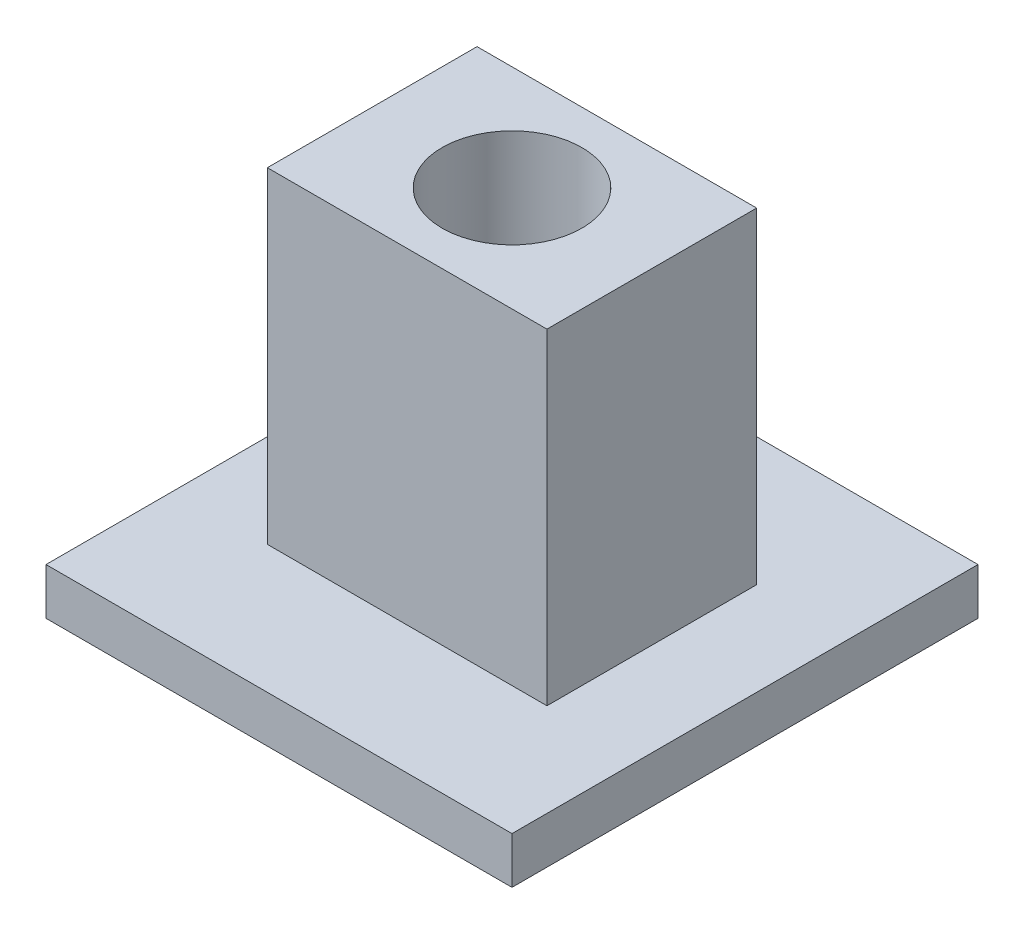
ISO-10303-21;
HEADER;
FILE_DESCRIPTION(('STEP AP214'),'2;1');
FILE_NAME('part.step','',(''),(''),'','','');
FILE_SCHEMA(('AUTOMOTIVE_DESIGN { 1 0 10303 214 1 1 1 1 }'));
ENDSEC;
DATA;
#1=APPLICATION_CONTEXT('core data for automotive mechanical design processes');
#2=APPLICATION_PROTOCOL_DEFINITION('international standard','automotive_design',2000,#1);
#3=PRODUCT_CONTEXT('',#1,'mechanical');
#4=PRODUCT('Part','Part','',(#3));
#5=PRODUCT_RELATED_PRODUCT_CATEGORY('part','',(#4));
#6=PRODUCT_DEFINITION_FORMATION('','',#4);
#7=PRODUCT_DEFINITION_CONTEXT('part definition',#1,'design');
#8=PRODUCT_DEFINITION('design','',#6,#7);
#9=PRODUCT_DEFINITION_SHAPE('','',#8);
#10=(LENGTH_UNIT() NAMED_UNIT(*) SI_UNIT(.MILLI.,.METRE.));
#11=(NAMED_UNIT(*) PLANE_ANGLE_UNIT() SI_UNIT($,.RADIAN.));
#12=(NAMED_UNIT(*) SI_UNIT($,.STERADIAN.) SOLID_ANGLE_UNIT());
#13=UNCERTAINTY_MEASURE_WITH_UNIT(LENGTH_MEASURE(1.E-05),#10,'distance_accuracy_value','');
#14=(GEOMETRIC_REPRESENTATION_CONTEXT(3) GLOBAL_UNCERTAINTY_ASSIGNED_CONTEXT((#13)) GLOBAL_UNIT_ASSIGNED_CONTEXT((#10,
#11,#12)) REPRESENTATION_CONTEXT('',''));
#15=CARTESIAN_POINT('',(0.,0.,0.));
#16=DIRECTION('',(0.,0.,1.));
#17=DIRECTION('',(1.,0.,0.));
#18=AXIS2_PLACEMENT_3D('',#15,#16,#17);
#19=CARTESIAN_POINT('',(0.,2.,0.));
#20=DIRECTION('',(0.,-1.,0.));
#21=DIRECTION('',(0.,0.,-1.));
#22=AXIS2_PLACEMENT_3D('',#19,#20,#21);
#23=PLANE('',#22);
#24=DIRECTION('',(0.,0.,-1.));
#25=VECTOR('',#24,1.);
#26=CARTESIAN_POINT('',(10.,2.,10.));
#27=LINE('',#26,#25);
#28=CARTESIAN_POINT('',(10.,2.,10.));
#29=VERTEX_POINT('',#28);
#30=CARTESIAN_POINT('',(10.,2.,-9.99999999999999));
#31=VERTEX_POINT('',#30);
#32=EDGE_CURVE('E131',#29,#31,#27,.T.);
#33=ORIENTED_EDGE('',*,*,#32,.T.);
#34=DIRECTION('',(-1.,0.,0.));
#35=VECTOR('',#34,1.);
#36=CARTESIAN_POINT('',(-10.,2.,-9.99999999999999));
#37=LINE('',#36,#35);
#38=CARTESIAN_POINT('',(-10.,2.,-9.99999999999999));
#39=VERTEX_POINT('',#38);
#40=EDGE_CURVE('E134',#31,#39,#37,.T.);
#41=ORIENTED_EDGE('',*,*,#40,.T.);
#42=DIRECTION('',(0.,0.,1.));
#43=VECTOR('',#42,1.);
#44=CARTESIAN_POINT('',(-10.,2.,10.));
#45=LINE('',#44,#43);
#46=CARTESIAN_POINT('',(-10.,2.,10.));
#47=VERTEX_POINT('',#46);
#48=EDGE_CURVE('E137',#39,#47,#45,.T.);
#49=ORIENTED_EDGE('',*,*,#48,.T.);
#50=DIRECTION('',(1.,0.,0.));
#51=VECTOR('',#50,1.);
#52=CARTESIAN_POINT('',(-10.,2.,10.));
#53=LINE('',#52,#51);
#54=EDGE_CURVE('E139',#47,#29,#53,.T.);
#55=ORIENTED_EDGE('',*,*,#54,.T.);
#56=EDGE_LOOP('',(#33,#41,#49,#55));
#57=FACE_BOUND('',#56,.T.);
#58=DIRECTION('',(0.,0.,-1.));
#59=VECTOR('',#58,1.);
#60=CARTESIAN_POINT('',(6.,2.,4.5));
#61=LINE('',#60,#59);
#62=CARTESIAN_POINT('',(6.,2.,4.5));
#63=VERTEX_POINT('',#62);
#64=CARTESIAN_POINT('',(6.,2.,-4.5));
#65=VERTEX_POINT('',#64);
#66=EDGE_CURVE('E121',#63,#65,#61,.T.);
#67=ORIENTED_EDGE('',*,*,#66,.F.);
#68=DIRECTION('',(1.,0.,0.));
#69=VECTOR('',#68,1.);
#70=CARTESIAN_POINT('',(-6.,2.,4.5));
#71=LINE('',#70,#69);
#72=CARTESIAN_POINT('',(-6.,2.,4.5));
#73=VERTEX_POINT('',#72);
#74=EDGE_CURVE('E118',#73,#63,#71,.T.);
#75=ORIENTED_EDGE('',*,*,#74,.F.);
#76=DIRECTION('',(0.,0.,1.));
#77=VECTOR('',#76,1.);
#78=CARTESIAN_POINT('',(-6.,2.,4.5));
#79=LINE('',#78,#77);
#80=CARTESIAN_POINT('',(-6.,2.,-4.5));
#81=VERTEX_POINT('',#80);
#82=EDGE_CURVE('E55',#81,#73,#79,.T.);
#83=ORIENTED_EDGE('',*,*,#82,.F.);
#84=DIRECTION('',(-1.,0.,0.));
#85=VECTOR('',#84,1.);
#86=CARTESIAN_POINT('',(-6.,2.,-4.5));
#87=LINE('',#86,#85);
#88=EDGE_CURVE('E50',#65,#81,#87,.T.);
#89=ORIENTED_EDGE('',*,*,#88,.F.);
#90=EDGE_LOOP('',(#67,#75,#83,#89));
#91=FACE_BOUND('',#90,.T.);
#92=ADVANCED_FACE('F35',(#57,#91),#23,.F.);
#93=CARTESIAN_POINT('',(10.,2.,10.));
#94=DIRECTION('',(-1.,0.,0.));
#95=DIRECTION('',(0.,0.,1.));
#96=AXIS2_PLACEMENT_3D('',#93,#94,#95);
#97=PLANE('',#96);
#98=DIRECTION('',(0.,0.,-1.));
#99=VECTOR('',#98,1.);
#100=CARTESIAN_POINT('',(10.,0.,10.));
#101=LINE('',#100,#99);
#102=CARTESIAN_POINT('',(10.,0.,10.));
#103=VERTEX_POINT('',#102);
#104=CARTESIAN_POINT('',(10.,0.,-9.99999999999999));
#105=VERTEX_POINT('',#104);
#106=EDGE_CURVE('E122',#103,#105,#101,.T.);
#107=ORIENTED_EDGE('',*,*,#106,.T.);
#108=DIRECTION('',(0.,-1.,0.));
#109=VECTOR('',#108,1.);
#110=CARTESIAN_POINT('',(10.,2.,-9.99999999999999));
#111=LINE('',#110,#109);
#112=EDGE_CURVE('E11',#31,#105,#111,.T.);
#113=ORIENTED_EDGE('',*,*,#112,.F.);
#114=ORIENTED_EDGE('',*,*,#32,.F.);
#115=DIRECTION('',(0.,-1.,0.));
#116=VECTOR('',#115,1.);
#117=CARTESIAN_POINT('',(10.,2.,10.));
#118=LINE('',#117,#116);
#119=EDGE_CURVE('E140',#29,#103,#118,.T.);
#120=ORIENTED_EDGE('',*,*,#119,.T.);
#121=EDGE_LOOP('',(#107,#113,#114,#120));
#122=FACE_BOUND('',#121,.T.);
#123=ADVANCED_FACE('F37',(#122),#97,.F.);
#124=CARTESIAN_POINT('',(-10.,2.,-9.99999999999999));
#125=DIRECTION('',(0.,0.,1.));
#126=DIRECTION('',(1.,0.,0.));
#127=AXIS2_PLACEMENT_3D('',#124,#125,#126);
#128=PLANE('',#127);
#129=DIRECTION('',(-1.,0.,0.));
#130=VECTOR('',#129,1.);
#131=CARTESIAN_POINT('',(-10.,0.,-9.99999999999999));
#132=LINE('',#131,#130);
#133=CARTESIAN_POINT('',(-10.,0.,-9.99999999999999));
#134=VERTEX_POINT('',#133);
#135=EDGE_CURVE('E125',#105,#134,#132,.T.);
#136=ORIENTED_EDGE('',*,*,#135,.T.);
#137=DIRECTION('',(0.,-1.,0.));
#138=VECTOR('',#137,1.);
#139=CARTESIAN_POINT('',(-10.,2.,-9.99999999999999));
#140=LINE('',#139,#138);
#141=EDGE_CURVE('E43',#39,#134,#140,.T.);
#142=ORIENTED_EDGE('',*,*,#141,.F.);
#143=ORIENTED_EDGE('',*,*,#40,.F.);
#144=ORIENTED_EDGE('',*,*,#112,.T.);
#145=EDGE_LOOP('',(#136,#142,#143,#144));
#146=FACE_BOUND('',#145,.T.);
#147=ADVANCED_FACE('F170',(#146),#128,.F.);
#148=CARTESIAN_POINT('',(-10.,2.,10.));
#149=DIRECTION('',(1.,0.,0.));
#150=DIRECTION('',(0.,0.,-1.));
#151=AXIS2_PLACEMENT_3D('',#148,#149,#150);
#152=PLANE('',#151);
#153=DIRECTION('',(0.,0.,1.));
#154=VECTOR('',#153,1.);
#155=CARTESIAN_POINT('',(-10.,0.,10.));
#156=LINE('',#155,#154);
#157=CARTESIAN_POINT('',(-10.,0.,10.));
#158=VERTEX_POINT('',#157);
#159=EDGE_CURVE('E143',#134,#158,#156,.T.);
#160=ORIENTED_EDGE('',*,*,#159,.T.);
#161=DIRECTION('',(0.,-1.,0.));
#162=VECTOR('',#161,1.);
#163=CARTESIAN_POINT('',(-10.,2.,10.));
#164=LINE('',#163,#162);
#165=EDGE_CURVE('E148',#47,#158,#164,.T.);
#166=ORIENTED_EDGE('',*,*,#165,.F.);
#167=ORIENTED_EDGE('',*,*,#48,.F.);
#168=ORIENTED_EDGE('',*,*,#141,.T.);
#169=EDGE_LOOP('',(#160,#166,#167,#168));
#170=FACE_BOUND('',#169,.T.);
#171=ADVANCED_FACE('F155',(#170),#152,.F.);
#172=CARTESIAN_POINT('',(-10.,2.,10.));
#173=DIRECTION('',(0.,0.,-1.));
#174=DIRECTION('',(-1.,0.,0.));
#175=AXIS2_PLACEMENT_3D('',#172,#173,#174);
#176=PLANE('',#175);
#177=DIRECTION('',(1.,0.,0.));
#178=VECTOR('',#177,1.);
#179=CARTESIAN_POINT('',(-10.,0.,10.));
#180=LINE('',#179,#178);
#181=EDGE_CURVE('E135',#158,#103,#180,.T.);
#182=ORIENTED_EDGE('',*,*,#181,.T.);
#183=ORIENTED_EDGE('',*,*,#119,.F.);
#184=ORIENTED_EDGE('',*,*,#54,.F.);
#185=ORIENTED_EDGE('',*,*,#165,.T.);
#186=EDGE_LOOP('',(#182,#183,#184,#185));
#187=FACE_BOUND('',#186,.T.);
#188=ADVANCED_FACE('F164',(#187),#176,.F.);
#189=CARTESIAN_POINT('',(0.,0.,0.));
#190=DIRECTION('',(0.,-1.,0.));
#191=DIRECTION('',(0.,0.,-1.));
#192=AXIS2_PLACEMENT_3D('',#189,#190,#191);
#193=PLANE('',#192);
#194=ORIENTED_EDGE('',*,*,#106,.F.);
#195=ORIENTED_EDGE('',*,*,#181,.F.);
#196=ORIENTED_EDGE('',*,*,#159,.F.);
#197=ORIENTED_EDGE('',*,*,#135,.F.);
#198=EDGE_LOOP('',(#194,#195,#196,#197));
#199=FACE_BOUND('',#198,.T.);
#200=ADVANCED_FACE('F161',(#199),#193,.T.);
#201=CARTESIAN_POINT('',(0.,16.,0.));
#202=DIRECTION('',(0.,-1.,0.));
#203=DIRECTION('',(0.,0.,-1.));
#204=AXIS2_PLACEMENT_3D('',#201,#202,#203);
#205=PLANE('',#204);
#206=DIRECTION('',(0.,0.,-1.));
#207=VECTOR('',#206,1.);
#208=CARTESIAN_POINT('',(6.,16.,4.5));
#209=LINE('',#208,#207);
#210=CARTESIAN_POINT('',(6.,16.,4.5));
#211=VERTEX_POINT('',#210);
#212=CARTESIAN_POINT('',(6.,16.,-4.5));
#213=VERTEX_POINT('',#212);
#214=EDGE_CURVE('E108',#211,#213,#209,.T.);
#215=ORIENTED_EDGE('',*,*,#214,.T.);
#216=DIRECTION('',(-1.,0.,0.));
#217=VECTOR('',#216,1.);
#218=CARTESIAN_POINT('',(-6.,16.,-4.5));
#219=LINE('',#218,#217);
#220=CARTESIAN_POINT('',(-6.,16.,-4.5));
#221=VERTEX_POINT('',#220);
#222=EDGE_CURVE('E97',#213,#221,#219,.T.);
#223=ORIENTED_EDGE('',*,*,#222,.T.);
#224=DIRECTION('',(0.,0.,1.));
#225=VECTOR('',#224,1.);
#226=CARTESIAN_POINT('',(-6.,16.,4.5));
#227=LINE('',#226,#225);
#228=CARTESIAN_POINT('',(-6.,16.,4.5));
#229=VERTEX_POINT('',#228);
#230=EDGE_CURVE('E107',#221,#229,#227,.T.);
#231=ORIENTED_EDGE('',*,*,#230,.T.);
#232=DIRECTION('',(1.,0.,0.));
#233=VECTOR('',#232,1.);
#234=CARTESIAN_POINT('',(-6.,16.,4.5));
#235=LINE('',#234,#233);
#236=EDGE_CURVE('E114',#229,#211,#235,.T.);
#237=ORIENTED_EDGE('',*,*,#236,.T.);
#238=EDGE_LOOP('',(#215,#223,#231,#237));
#239=FACE_BOUND('',#238,.T.);
#240=CARTESIAN_POINT('',(0.,16.,0.));
#241=DIRECTION('',(0.,1.,0.));
#242=DIRECTION('',(0.,0.,1.));
#243=AXIS2_PLACEMENT_3D('',#240,#241,#242);
#244=CIRCLE('',#243,3.);
#245=CARTESIAN_POINT('',(0.,16.,3.));
#246=VERTEX_POINT('',#245);
#247=EDGE_CURVE('E197',#246,#246,#244,.T.);
#248=ORIENTED_EDGE('',*,*,#247,.F.);
#249=EDGE_LOOP('',(#248));
#250=FACE_BOUND('',#249,.T.);
#251=ADVANCED_FACE('F111',(#239,#250),#205,.F.);
#252=CARTESIAN_POINT('',(6.,16.,4.5));
#253=DIRECTION('',(-1.,0.,0.));
#254=DIRECTION('',(0.,0.,1.));
#255=AXIS2_PLACEMENT_3D('',#252,#253,#254);
#256=PLANE('',#255);
#257=ORIENTED_EDGE('',*,*,#66,.T.);
#258=DIRECTION('',(0.,-1.,0.));
#259=VECTOR('',#258,1.);
#260=CARTESIAN_POINT('',(6.,16.,-4.5));
#261=LINE('',#260,#259);
#262=EDGE_CURVE('E101',#213,#65,#261,.T.);
#263=ORIENTED_EDGE('',*,*,#262,.F.);
#264=ORIENTED_EDGE('',*,*,#214,.F.);
#265=DIRECTION('',(0.,-1.,0.));
#266=VECTOR('',#265,1.);
#267=CARTESIAN_POINT('',(6.,16.,4.5));
#268=LINE('',#267,#266);
#269=EDGE_CURVE('E204',#211,#63,#268,.T.);
#270=ORIENTED_EDGE('',*,*,#269,.T.);
#271=EDGE_LOOP('',(#257,#263,#264,#270));
#272=FACE_BOUND('',#271,.T.);
#273=ADVANCED_FACE('F120',(#272),#256,.F.);
#274=CARTESIAN_POINT('',(-6.,16.,-4.5));
#275=DIRECTION('',(0.,0.,1.));
#276=DIRECTION('',(1.,0.,0.));
#277=AXIS2_PLACEMENT_3D('',#274,#275,#276);
#278=PLANE('',#277);
#279=ORIENTED_EDGE('',*,*,#88,.T.);
#280=DIRECTION('',(0.,-1.,0.));
#281=VECTOR('',#280,1.);
#282=CARTESIAN_POINT('',(-6.,16.,-4.5));
#283=LINE('',#282,#281);
#284=EDGE_CURVE('E104',#221,#81,#283,.T.);
#285=ORIENTED_EDGE('',*,*,#284,.F.);
#286=ORIENTED_EDGE('',*,*,#222,.F.);
#287=ORIENTED_EDGE('',*,*,#262,.T.);
#288=EDGE_LOOP('',(#279,#285,#286,#287));
#289=FACE_BOUND('',#288,.T.);
#290=ADVANCED_FACE('F99',(#289),#278,.F.);
#291=CARTESIAN_POINT('',(-6.,16.,4.5));
#292=DIRECTION('',(1.,0.,0.));
#293=DIRECTION('',(0.,0.,-1.));
#294=AXIS2_PLACEMENT_3D('',#291,#292,#293);
#295=PLANE('',#294);
#296=ORIENTED_EDGE('',*,*,#82,.T.);
#297=DIRECTION('',(0.,-1.,0.));
#298=VECTOR('',#297,1.);
#299=CARTESIAN_POINT('',(-6.,16.,4.5));
#300=LINE('',#299,#298);
#301=EDGE_CURVE('E127',#229,#73,#300,.T.);
#302=ORIENTED_EDGE('',*,*,#301,.F.);
#303=ORIENTED_EDGE('',*,*,#230,.F.);
#304=ORIENTED_EDGE('',*,*,#284,.T.);
#305=EDGE_LOOP('',(#296,#302,#303,#304));
#306=FACE_BOUND('',#305,.T.);
#307=ADVANCED_FACE('F214',(#306),#295,.F.);
#308=CARTESIAN_POINT('',(-6.,16.,4.5));
#309=DIRECTION('',(0.,0.,-1.));
#310=DIRECTION('',(-1.,0.,0.));
#311=AXIS2_PLACEMENT_3D('',#308,#309,#310);
#312=PLANE('',#311);
#313=ORIENTED_EDGE('',*,*,#74,.T.);
#314=ORIENTED_EDGE('',*,*,#269,.F.);
#315=ORIENTED_EDGE('',*,*,#236,.F.);
#316=ORIENTED_EDGE('',*,*,#301,.T.);
#317=EDGE_LOOP('',(#313,#314,#315,#316));
#318=FACE_BOUND('',#317,.T.);
#319=ADVANCED_FACE('F190',(#318),#312,.F.);
#320=CARTESIAN_POINT('',(0.,16.,0.));
#321=DIRECTION('',(0.,-1.,0.));
#322=DIRECTION('',(0.,0.,-1.));
#323=AXIS2_PLACEMENT_3D('',#320,#321,#322);
#324=CYLINDRICAL_SURFACE('',#323,3.);
#325=ORIENTED_EDGE('',*,*,#247,.T.);
#326=EDGE_LOOP('',(#325));
#327=FACE_BOUND('',#326,.T.);
#328=CARTESIAN_POINT('',(0.,2.,0.));
#329=DIRECTION('',(0.,1.,0.));
#330=DIRECTION('',(0.,0.,1.));
#331=AXIS2_PLACEMENT_3D('',#328,#329,#330);
#332=CIRCLE('',#331,3.);
#333=CARTESIAN_POINT('',(0.,2.,3.));
#334=VERTEX_POINT('',#333);
#335=EDGE_CURVE('E195',#334,#334,#332,.T.);
#336=ORIENTED_EDGE('',*,*,#335,.F.);
#337=EDGE_LOOP('',(#336));
#338=FACE_BOUND('',#337,.T.);
#339=ADVANCED_FACE('F185',(#327,#338),#324,.F.);
#340=ORIENTED_EDGE('',*,*,#335,.T.);
#341=EDGE_LOOP('',(#340));
#342=FACE_BOUND('',#341,.T.);
#343=ADVANCED_FACE('F179',(#342),#23,.F.);
#344=CLOSED_SHELL('',(#92,#123,#147,#171,#188,#200,#251,#273,#290,#307,#319,#339,#343));
#345=MANIFOLD_SOLID_BREP('B2',#344);
#346=ADVANCED_BREP_SHAPE_REPRESENTATION('',(#18,#345),#14);
#347=SHAPE_DEFINITION_REPRESENTATION(#9,#346);
ENDSEC;
END-ISO-10303-21;
